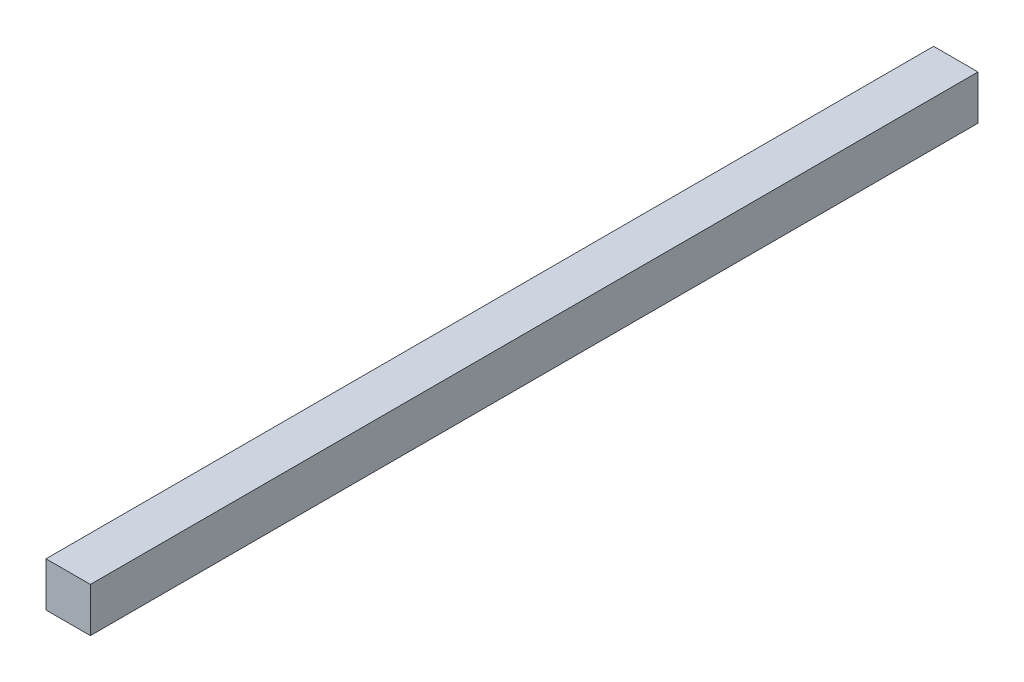
ISO-10303-21;
HEADER;
FILE_DESCRIPTION(('STEP AP214'),'2;1');
FILE_NAME('part.step','',(''),(''),'','','');
FILE_SCHEMA(('AUTOMOTIVE_DESIGN { 1 0 10303 214 1 1 1 1 }'));
ENDSEC;
DATA;
#1=APPLICATION_CONTEXT('core data for automotive mechanical design processes');
#2=APPLICATION_PROTOCOL_DEFINITION('international standard','automotive_design',2000,#1);
#3=PRODUCT_CONTEXT('',#1,'mechanical');
#4=PRODUCT('Part','Part','',(#3));
#5=PRODUCT_RELATED_PRODUCT_CATEGORY('part','',(#4));
#6=PRODUCT_DEFINITION_FORMATION('','',#4);
#7=PRODUCT_DEFINITION_CONTEXT('part definition',#1,'design');
#8=PRODUCT_DEFINITION('design','',#6,#7);
#9=PRODUCT_DEFINITION_SHAPE('','',#8);
#10=(LENGTH_UNIT() NAMED_UNIT(*) SI_UNIT(.MILLI.,.METRE.));
#11=(NAMED_UNIT(*) PLANE_ANGLE_UNIT() SI_UNIT($,.RADIAN.));
#12=(NAMED_UNIT(*) SI_UNIT($,.STERADIAN.) SOLID_ANGLE_UNIT());
#13=UNCERTAINTY_MEASURE_WITH_UNIT(LENGTH_MEASURE(1.E-05),#10,'distance_accuracy_value','');
#14=(GEOMETRIC_REPRESENTATION_CONTEXT(3) GLOBAL_UNCERTAINTY_ASSIGNED_CONTEXT((#13)) GLOBAL_UNIT_ASSIGNED_CONTEXT((#10,
#11,#12)) REPRESENTATION_CONTEXT('',''));
#15=CARTESIAN_POINT('',(0.,0.,0.));
#16=DIRECTION('',(0.,0.,1.));
#17=DIRECTION('',(1.,0.,0.));
#18=AXIS2_PLACEMENT_3D('',#15,#16,#17);
#19=CARTESIAN_POINT('',(0.,0.,304.8));
#20=DIRECTION('',(-1.,0.,0.));
#21=DIRECTION('',(0.,0.,1.));
#22=AXIS2_PLACEMENT_3D('',#19,#20,#21);
#23=PLANE('',#22);
#24=DIRECTION('',(0.,1.,0.));
#25=VECTOR('',#24,1.);
#26=CARTESIAN_POINT('',(0.,0.,0.));
#27=LINE('',#26,#25);
#28=CARTESIAN_POINT('',(0.,0.,0.));
#29=VERTEX_POINT('',#28);
#30=CARTESIAN_POINT('',(0.,15.24,0.));
#31=VERTEX_POINT('',#30);
#32=EDGE_CURVE('E96',#29,#31,#27,.T.);
#33=ORIENTED_EDGE('',*,*,#32,.T.);
#34=DIRECTION('',(0.,0.,-1.));
#35=VECTOR('',#34,1.);
#36=CARTESIAN_POINT('',(0.,15.24,304.8));
#37=LINE('',#36,#35);
#38=CARTESIAN_POINT('',(0.,15.24,304.8));
#39=VERTEX_POINT('',#38);
#40=EDGE_CURVE('E11',#39,#31,#37,.T.);
#41=ORIENTED_EDGE('',*,*,#40,.F.);
#42=DIRECTION('',(0.,1.,0.));
#43=VECTOR('',#42,1.);
#44=CARTESIAN_POINT('',(0.,0.,304.8));
#45=LINE('',#44,#43);
#46=CARTESIAN_POINT('',(0.,0.,304.8));
#47=VERTEX_POINT('',#46);
#48=EDGE_CURVE('E84',#47,#39,#45,.T.);
#49=ORIENTED_EDGE('',*,*,#48,.F.);
#50=DIRECTION('',(0.,0.,-1.));
#51=VECTOR('',#50,1.);
#52=CARTESIAN_POINT('',(0.,0.,304.8));
#53=LINE('',#52,#51);
#54=EDGE_CURVE('E92',#47,#29,#53,.T.);
#55=ORIENTED_EDGE('',*,*,#54,.T.);
#56=EDGE_LOOP('',(#33,#41,#49,#55));
#57=FACE_BOUND('',#56,.T.);
#58=ADVANCED_FACE('F33',(#57),#23,.F.);
#59=CARTESIAN_POINT('',(0.,15.24,304.8));
#60=DIRECTION('',(0.,-1.,0.));
#61=DIRECTION('',(1.,0.,0.));
#62=AXIS2_PLACEMENT_3D('',#59,#60,#61);
#63=PLANE('',#62);
#64=DIRECTION('',(-1.,0.,0.));
#65=VECTOR('',#64,1.);
#66=CARTESIAN_POINT('',(0.,15.24,0.));
#67=LINE('',#66,#65);
#68=CARTESIAN_POINT('',(-15.24,15.24,0.));
#69=VERTEX_POINT('',#68);
#70=EDGE_CURVE('E88',#31,#69,#67,.T.);
#71=ORIENTED_EDGE('',*,*,#70,.T.);
#72=DIRECTION('',(0.,0.,-1.));
#73=VECTOR('',#72,1.);
#74=CARTESIAN_POINT('',(-15.24,15.24,304.8));
#75=LINE('',#74,#73);
#76=CARTESIAN_POINT('',(-15.24,15.24,304.8));
#77=VERTEX_POINT('',#76);
#78=EDGE_CURVE('E41',#77,#69,#75,.T.);
#79=ORIENTED_EDGE('',*,*,#78,.F.);
#80=DIRECTION('',(-1.,0.,0.));
#81=VECTOR('',#80,1.);
#82=CARTESIAN_POINT('',(0.,15.24,304.8));
#83=LINE('',#82,#81);
#84=EDGE_CURVE('E79',#39,#77,#83,.T.);
#85=ORIENTED_EDGE('',*,*,#84,.F.);
#86=ORIENTED_EDGE('',*,*,#40,.T.);
#87=EDGE_LOOP('',(#71,#79,#85,#86));
#88=FACE_BOUND('',#87,.T.);
#89=ADVANCED_FACE('F87',(#88),#63,.F.);
#90=CARTESIAN_POINT('',(-15.24,0.,304.8));
#91=DIRECTION('',(1.,0.,0.));
#92=DIRECTION('',(0.,0.,-1.));
#93=AXIS2_PLACEMENT_3D('',#90,#91,#92);
#94=PLANE('',#93);
#95=DIRECTION('',(0.,-1.,0.));
#96=VECTOR('',#95,1.);
#97=CARTESIAN_POINT('',(-15.24,0.,0.));
#98=LINE('',#97,#96);
#99=CARTESIAN_POINT('',(-15.24,0.,0.));
#100=VERTEX_POINT('',#99);
#101=EDGE_CURVE('E66',#69,#100,#98,.T.);
#102=ORIENTED_EDGE('',*,*,#101,.T.);
#103=DIRECTION('',(0.,0.,-1.));
#104=VECTOR('',#103,1.);
#105=CARTESIAN_POINT('',(-15.24,0.,304.8));
#106=LINE('',#105,#104);
#107=CARTESIAN_POINT('',(-15.24,0.,304.8));
#108=VERTEX_POINT('',#107);
#109=EDGE_CURVE('E89',#108,#100,#106,.T.);
#110=ORIENTED_EDGE('',*,*,#109,.F.);
#111=DIRECTION('',(0.,-1.,0.));
#112=VECTOR('',#111,1.);
#113=CARTESIAN_POINT('',(-15.24,0.,304.8));
#114=LINE('',#113,#112);
#115=EDGE_CURVE('E82',#77,#108,#114,.T.);
#116=ORIENTED_EDGE('',*,*,#115,.F.);
#117=ORIENTED_EDGE('',*,*,#78,.T.);
#118=EDGE_LOOP('',(#102,#110,#116,#117));
#119=FACE_BOUND('',#118,.T.);
#120=ADVANCED_FACE('F90',(#119),#94,.F.);
#121=CARTESIAN_POINT('',(0.,0.,304.8));
#122=DIRECTION('',(0.,1.,0.));
#123=DIRECTION('',(-1.,0.,0.));
#124=AXIS2_PLACEMENT_3D('',#121,#122,#123);
#125=PLANE('',#124);
#126=DIRECTION('',(1.,0.,0.));
#127=VECTOR('',#126,1.);
#128=CARTESIAN_POINT('',(0.,0.,0.));
#129=LINE('',#128,#127);
#130=EDGE_CURVE('E72',#100,#29,#129,.T.);
#131=ORIENTED_EDGE('',*,*,#130,.T.);
#132=ORIENTED_EDGE('',*,*,#54,.F.);
#133=DIRECTION('',(1.,0.,0.));
#134=VECTOR('',#133,1.);
#135=CARTESIAN_POINT('',(0.,0.,304.8));
#136=LINE('',#135,#134);
#137=EDGE_CURVE('E49',#108,#47,#136,.T.);
#138=ORIENTED_EDGE('',*,*,#137,.F.);
#139=ORIENTED_EDGE('',*,*,#109,.T.);
#140=EDGE_LOOP('',(#131,#132,#138,#139));
#141=FACE_BOUND('',#140,.T.);
#142=ADVANCED_FACE('F103',(#141),#125,.F.);
#143=CARTESIAN_POINT('',(0.,0.,304.8));
#144=DIRECTION('',(0.,0.,1.));
#145=DIRECTION('',(1.,0.,0.));
#146=AXIS2_PLACEMENT_3D('',#143,#144,#145);
#147=PLANE('',#146);
#148=ORIENTED_EDGE('',*,*,#48,.T.);
#149=ORIENTED_EDGE('',*,*,#84,.T.);
#150=ORIENTED_EDGE('',*,*,#115,.T.);
#151=ORIENTED_EDGE('',*,*,#137,.T.);
#152=EDGE_LOOP('',(#148,#149,#150,#151));
#153=FACE_BOUND('',#152,.T.);
#154=ADVANCED_FACE('F80',(#153),#147,.T.);
#155=CARTESIAN_POINT('',(0.,0.,0.));
#156=DIRECTION('',(0.,0.,1.));
#157=DIRECTION('',(1.,0.,0.));
#158=AXIS2_PLACEMENT_3D('',#155,#156,#157);
#159=PLANE('',#158);
#160=ORIENTED_EDGE('',*,*,#32,.F.);
#161=ORIENTED_EDGE('',*,*,#130,.F.);
#162=ORIENTED_EDGE('',*,*,#101,.F.);
#163=ORIENTED_EDGE('',*,*,#70,.F.);
#164=EDGE_LOOP('',(#160,#161,#162,#163));
#165=FACE_BOUND('',#164,.T.);
#166=ADVANCED_FACE('F106',(#165),#159,.F.);
#167=CLOSED_SHELL('',(#58,#89,#120,#142,#154,#166));
#168=MANIFOLD_SOLID_BREP('B2',#167);
#169=ADVANCED_BREP_SHAPE_REPRESENTATION('',(#18,#168),#14);
#170=SHAPE_DEFINITION_REPRESENTATION(#9,#169);
ENDSEC;
END-ISO-10303-21;
